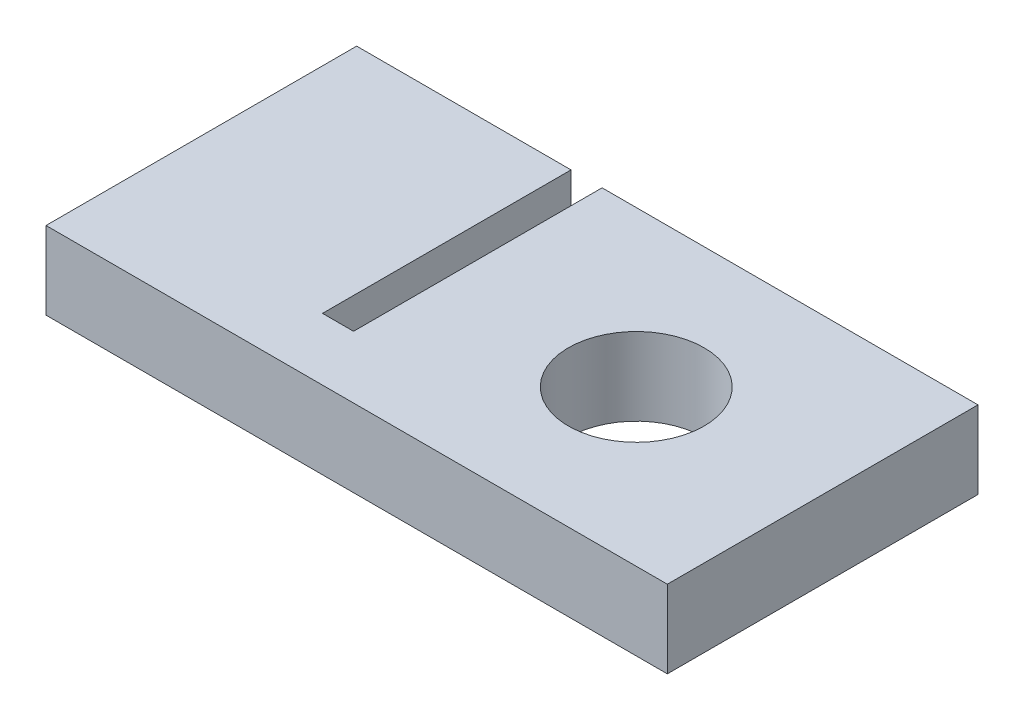
ISO-10303-21;
HEADER;
FILE_DESCRIPTION(('STEP AP214'),'2;1');
FILE_NAME('part.step','',(''),(''),'','','');
FILE_SCHEMA(('AUTOMOTIVE_DESIGN { 1 0 10303 214 1 1 1 1 }'));
ENDSEC;
DATA;
#1=APPLICATION_CONTEXT('core data for automotive mechanical design processes');
#2=APPLICATION_PROTOCOL_DEFINITION('international standard','automotive_design',2000,#1);
#3=PRODUCT_CONTEXT('',#1,'mechanical');
#4=PRODUCT('Part','Part','',(#3));
#5=PRODUCT_RELATED_PRODUCT_CATEGORY('part','',(#4));
#6=PRODUCT_DEFINITION_FORMATION('','',#4);
#7=PRODUCT_DEFINITION_CONTEXT('part definition',#1,'design');
#8=PRODUCT_DEFINITION('design','',#6,#7);
#9=PRODUCT_DEFINITION_SHAPE('','',#8);
#10=(LENGTH_UNIT() NAMED_UNIT(*) SI_UNIT(.MILLI.,.METRE.));
#11=(NAMED_UNIT(*) PLANE_ANGLE_UNIT() SI_UNIT($,.RADIAN.));
#12=(NAMED_UNIT(*) SI_UNIT($,.STERADIAN.) SOLID_ANGLE_UNIT());
#13=UNCERTAINTY_MEASURE_WITH_UNIT(LENGTH_MEASURE(1.E-05),#10,'distance_accuracy_value','');
#14=(GEOMETRIC_REPRESENTATION_CONTEXT(3) GLOBAL_UNCERTAINTY_ASSIGNED_CONTEXT((#13)) GLOBAL_UNIT_ASSIGNED_CONTEXT((#10,
#11,#12)) REPRESENTATION_CONTEXT('',''));
#15=CARTESIAN_POINT('',(0.,0.,0.));
#16=DIRECTION('',(0.,0.,1.));
#17=DIRECTION('',(1.,0.,0.));
#18=AXIS2_PLACEMENT_3D('',#15,#16,#17);
#19=CARTESIAN_POINT('',(5.,1.25,-2.5));
#20=DIRECTION('',(-1.,0.,0.));
#21=DIRECTION('',(0.,0.,-1.));
#22=AXIS2_PLACEMENT_3D('',#19,#20,#21);
#23=PLANE('',#22);
#24=DIRECTION('',(0.,0.,1.));
#25=VECTOR('',#24,1.);
#26=CARTESIAN_POINT('',(5.,0.,-2.5));
#27=LINE('',#26,#25);
#28=CARTESIAN_POINT('',(5.,0.,-2.5));
#29=VERTEX_POINT('',#28);
#30=CARTESIAN_POINT('',(5.,0.,2.5));
#31=VERTEX_POINT('',#30);
#32=EDGE_CURVE('E133',#29,#31,#27,.T.);
#33=ORIENTED_EDGE('',*,*,#32,.F.);
#34=DIRECTION('',(0.,-1.,0.));
#35=VECTOR('',#34,1.);
#36=CARTESIAN_POINT('',(5.,1.25,-2.5));
#37=LINE('',#36,#35);
#38=CARTESIAN_POINT('',(5.,1.25,-2.5));
#39=VERTEX_POINT('',#38);
#40=EDGE_CURVE('E132',#39,#29,#37,.T.);
#41=ORIENTED_EDGE('',*,*,#40,.F.);
#42=DIRECTION('',(0.,0.,1.));
#43=VECTOR('',#42,1.);
#44=CARTESIAN_POINT('',(5.,1.25,-2.5));
#45=LINE('',#44,#43);
#46=CARTESIAN_POINT('',(5.,1.25,2.5));
#47=VERTEX_POINT('',#46);
#48=EDGE_CURVE('E152',#39,#47,#45,.T.);
#49=ORIENTED_EDGE('',*,*,#48,.T.);
#50=DIRECTION('',(0.,-1.,0.));
#51=VECTOR('',#50,1.);
#52=CARTESIAN_POINT('',(5.,1.25,2.5));
#53=LINE('',#52,#51);
#54=EDGE_CURVE('E11',#47,#31,#53,.T.);
#55=ORIENTED_EDGE('',*,*,#54,.T.);
#56=EDGE_LOOP('',(#33,#41,#49,#55));
#57=FACE_BOUND('',#56,.T.);
#58=ADVANCED_FACE('F37',(#57),#23,.F.);
#59=CARTESIAN_POINT('',(-5.,1.25,2.5));
#60=DIRECTION('',(0.,0.,-1.));
#61=DIRECTION('',(1.,0.,0.));
#62=AXIS2_PLACEMENT_3D('',#59,#60,#61);
#63=PLANE('',#62);
#64=DIRECTION('',(-1.,0.,0.));
#65=VECTOR('',#64,1.);
#66=CARTESIAN_POINT('',(-5.,0.,2.5));
#67=LINE('',#66,#65);
#68=CARTESIAN_POINT('',(-5.,0.,2.5));
#69=VERTEX_POINT('',#68);
#70=EDGE_CURVE('E135',#31,#69,#67,.T.);
#71=ORIENTED_EDGE('',*,*,#70,.F.);
#72=ORIENTED_EDGE('',*,*,#54,.F.);
#73=DIRECTION('',(-1.,0.,0.));
#74=VECTOR('',#73,1.);
#75=CARTESIAN_POINT('',(-5.,1.25,2.5));
#76=LINE('',#75,#74);
#77=CARTESIAN_POINT('',(-5.,1.25,2.5));
#78=VERTEX_POINT('',#77);
#79=EDGE_CURVE('E91',#47,#78,#76,.T.);
#80=ORIENTED_EDGE('',*,*,#79,.T.);
#81=DIRECTION('',(0.,-1.,0.));
#82=VECTOR('',#81,1.);
#83=CARTESIAN_POINT('',(-5.,1.25,2.5));
#84=LINE('',#83,#82);
#85=EDGE_CURVE('E45',#78,#69,#84,.T.);
#86=ORIENTED_EDGE('',*,*,#85,.T.);
#87=EDGE_LOOP('',(#71,#72,#80,#86));
#88=FACE_BOUND('',#87,.T.);
#89=ADVANCED_FACE('F164',(#88),#63,.F.);
#90=CARTESIAN_POINT('',(-5.,1.25,-2.5));
#91=DIRECTION('',(1.,0.,0.));
#92=DIRECTION('',(0.,0.,1.));
#93=AXIS2_PLACEMENT_3D('',#90,#91,#92);
#94=PLANE('',#93);
#95=DIRECTION('',(0.,0.,-1.));
#96=VECTOR('',#95,1.);
#97=CARTESIAN_POINT('',(-5.,0.,-2.5));
#98=LINE('',#97,#96);
#99=CARTESIAN_POINT('',(-5.,0.,-2.5));
#100=VERTEX_POINT('',#99);
#101=EDGE_CURVE('E139',#69,#100,#98,.T.);
#102=ORIENTED_EDGE('',*,*,#101,.F.);
#103=ORIENTED_EDGE('',*,*,#85,.F.);
#104=DIRECTION('',(0.,0.,-1.));
#105=VECTOR('',#104,1.);
#106=CARTESIAN_POINT('',(-5.,1.25,-2.5));
#107=LINE('',#106,#105);
#108=CARTESIAN_POINT('',(-5.,1.25,-2.5));
#109=VERTEX_POINT('',#108);
#110=EDGE_CURVE('E173',#78,#109,#107,.T.);
#111=ORIENTED_EDGE('',*,*,#110,.T.);
#112=DIRECTION('',(0.,-1.,0.));
#113=VECTOR('',#112,1.);
#114=CARTESIAN_POINT('',(-5.,1.25,-2.5));
#115=LINE('',#114,#113);
#116=EDGE_CURVE('E159',#109,#100,#115,.T.);
#117=ORIENTED_EDGE('',*,*,#116,.T.);
#118=EDGE_LOOP('',(#102,#103,#111,#117));
#119=FACE_BOUND('',#118,.T.);
#120=ADVANCED_FACE('F186',(#119),#94,.F.);
#121=CARTESIAN_POINT('',(-5.,1.25,-2.5));
#122=DIRECTION('',(0.,0.,1.));
#123=DIRECTION('',(-1.,0.,0.));
#124=AXIS2_PLACEMENT_3D('',#121,#122,#123);
#125=PLANE('',#124);
#126=DIRECTION('',(1.,0.,0.));
#127=VECTOR('',#126,1.);
#128=CARTESIAN_POINT('',(-5.,0.,-2.5));
#129=LINE('',#128,#127);
#130=CARTESIAN_POINT('',(-1.55,0.,-2.5));
#131=VERTEX_POINT('',#130);
#132=EDGE_CURVE('E142',#100,#131,#129,.T.);
#133=ORIENTED_EDGE('',*,*,#132,.F.);
#134=ORIENTED_EDGE('',*,*,#116,.F.);
#135=DIRECTION('',(1.,0.,0.));
#136=VECTOR('',#135,1.);
#137=CARTESIAN_POINT('',(-5.,1.25,-2.5));
#138=LINE('',#137,#136);
#139=CARTESIAN_POINT('',(-1.55,1.25,-2.5));
#140=VERTEX_POINT('',#139);
#141=EDGE_CURVE('E127',#109,#140,#138,.T.);
#142=ORIENTED_EDGE('',*,*,#141,.T.);
#143=DIRECTION('',(0.,-1.,0.));
#144=VECTOR('',#143,1.);
#145=CARTESIAN_POINT('',(-1.55,1.25,-2.5));
#146=LINE('',#145,#144);
#147=EDGE_CURVE('E156',#140,#131,#146,.T.);
#148=ORIENTED_EDGE('',*,*,#147,.T.);
#149=EDGE_LOOP('',(#133,#134,#142,#148));
#150=FACE_BOUND('',#149,.T.);
#151=ADVANCED_FACE('F182',(#150),#125,.F.);
#152=CARTESIAN_POINT('',(-1.55,1.25,-2.5));
#153=DIRECTION('',(-1.,0.,0.));
#154=DIRECTION('',(0.,0.,-1.));
#155=AXIS2_PLACEMENT_3D('',#152,#153,#154);
#156=PLANE('',#155);
#157=DIRECTION('',(0.,0.,1.));
#158=VECTOR('',#157,1.);
#159=CARTESIAN_POINT('',(-1.55,0.,-2.5));
#160=LINE('',#159,#158);
#161=CARTESIAN_POINT('',(-1.55,0.,1.5));
#162=VERTEX_POINT('',#161);
#163=EDGE_CURVE('E145',#131,#162,#160,.T.);
#164=ORIENTED_EDGE('',*,*,#163,.F.);
#165=ORIENTED_EDGE('',*,*,#147,.F.);
#166=DIRECTION('',(0.,0.,1.));
#167=VECTOR('',#166,1.);
#168=CARTESIAN_POINT('',(-1.55,1.25,-2.5));
#169=LINE('',#168,#167);
#170=CARTESIAN_POINT('',(-1.55,1.25,1.5));
#171=VERTEX_POINT('',#170);
#172=EDGE_CURVE('E125',#140,#171,#169,.T.);
#173=ORIENTED_EDGE('',*,*,#172,.T.);
#174=DIRECTION('',(0.,-1.,0.));
#175=VECTOR('',#174,1.);
#176=CARTESIAN_POINT('',(-1.55,1.25,1.5));
#177=LINE('',#176,#175);
#178=EDGE_CURVE('E119',#171,#162,#177,.T.);
#179=ORIENTED_EDGE('',*,*,#178,.T.);
#180=EDGE_LOOP('',(#164,#165,#173,#179));
#181=FACE_BOUND('',#180,.T.);
#182=ADVANCED_FACE('F185',(#181),#156,.F.);
#183=CARTESIAN_POINT('',(-1.55,1.25,1.5));
#184=DIRECTION('',(0.,0.,1.));
#185=DIRECTION('',(-1.,0.,0.));
#186=AXIS2_PLACEMENT_3D('',#183,#184,#185);
#187=PLANE('',#186);
#188=DIRECTION('',(1.,0.,0.));
#189=VECTOR('',#188,1.);
#190=CARTESIAN_POINT('',(-1.55,0.,1.5));
#191=LINE('',#190,#189);
#192=CARTESIAN_POINT('',(-1.05,0.,1.5));
#193=VERTEX_POINT('',#192);
#194=EDGE_CURVE('E148',#162,#193,#191,.T.);
#195=ORIENTED_EDGE('',*,*,#194,.F.);
#196=ORIENTED_EDGE('',*,*,#178,.F.);
#197=DIRECTION('',(1.,0.,0.));
#198=VECTOR('',#197,1.);
#199=CARTESIAN_POINT('',(-1.55,1.25,1.5));
#200=LINE('',#199,#198);
#201=CARTESIAN_POINT('',(-1.05,1.25,1.5));
#202=VERTEX_POINT('',#201);
#203=EDGE_CURVE('E109',#171,#202,#200,.T.);
#204=ORIENTED_EDGE('',*,*,#203,.T.);
#205=DIRECTION('',(0.,-1.,0.));
#206=VECTOR('',#205,1.);
#207=CARTESIAN_POINT('',(-1.05,1.25,1.5));
#208=LINE('',#207,#206);
#209=EDGE_CURVE('E114',#202,#193,#208,.T.);
#210=ORIENTED_EDGE('',*,*,#209,.T.);
#211=EDGE_LOOP('',(#195,#196,#204,#210));
#212=FACE_BOUND('',#211,.T.);
#213=ADVANCED_FACE('F122',(#212),#187,.F.);
#214=CARTESIAN_POINT('',(-1.05,1.25,-2.5));
#215=DIRECTION('',(1.,0.,0.));
#216=DIRECTION('',(0.,0.,1.));
#217=AXIS2_PLACEMENT_3D('',#214,#215,#216);
#218=PLANE('',#217);
#219=DIRECTION('',(0.,0.,-1.));
#220=VECTOR('',#219,1.);
#221=CARTESIAN_POINT('',(-1.05,0.,-2.5));
#222=LINE('',#221,#220);
#223=CARTESIAN_POINT('',(-1.05,0.,-2.5));
#224=VERTEX_POINT('',#223);
#225=EDGE_CURVE('E116',#193,#224,#222,.T.);
#226=ORIENTED_EDGE('',*,*,#225,.F.);
#227=ORIENTED_EDGE('',*,*,#209,.F.);
#228=DIRECTION('',(0.,0.,-1.));
#229=VECTOR('',#228,1.);
#230=CARTESIAN_POINT('',(-1.05,1.25,-2.5));
#231=LINE('',#230,#229);
#232=CARTESIAN_POINT('',(-1.05,1.25,-2.5));
#233=VERTEX_POINT('',#232);
#234=EDGE_CURVE('E105',#202,#233,#231,.T.);
#235=ORIENTED_EDGE('',*,*,#234,.T.);
#236=DIRECTION('',(0.,-1.,0.));
#237=VECTOR('',#236,1.);
#238=CARTESIAN_POINT('',(-1.05,1.25,-2.5));
#239=LINE('',#238,#237);
#240=EDGE_CURVE('E120',#233,#224,#239,.T.);
#241=ORIENTED_EDGE('',*,*,#240,.T.);
#242=EDGE_LOOP('',(#226,#227,#235,#241));
#243=FACE_BOUND('',#242,.T.);
#244=ADVANCED_FACE('F115',(#243),#218,.F.);
#245=CARTESIAN_POINT('',(-1.05,1.25,-2.5));
#246=DIRECTION('',(0.,0.,1.));
#247=DIRECTION('',(-1.,0.,0.));
#248=AXIS2_PLACEMENT_3D('',#245,#246,#247);
#249=PLANE('',#248);
#250=DIRECTION('',(1.,0.,0.));
#251=VECTOR('',#250,1.);
#252=CARTESIAN_POINT('',(-1.05,0.,-2.5));
#253=LINE('',#252,#251);
#254=EDGE_CURVE('E79',#224,#29,#253,.T.);
#255=ORIENTED_EDGE('',*,*,#254,.F.);
#256=ORIENTED_EDGE('',*,*,#240,.F.);
#257=DIRECTION('',(1.,0.,0.));
#258=VECTOR('',#257,1.);
#259=CARTESIAN_POINT('',(-1.05,1.25,-2.5));
#260=LINE('',#259,#258);
#261=EDGE_CURVE('E53',#233,#39,#260,.T.);
#262=ORIENTED_EDGE('',*,*,#261,.T.);
#263=ORIENTED_EDGE('',*,*,#40,.T.);
#264=EDGE_LOOP('',(#255,#256,#262,#263));
#265=FACE_BOUND('',#264,.T.);
#266=ADVANCED_FACE('F236',(#265),#249,.F.);
#267=CARTESIAN_POINT('',(0.,1.25,0.));
#268=DIRECTION('',(0.,-1.,0.));
#269=DIRECTION('',(0.,0.,1.));
#270=AXIS2_PLACEMENT_3D('',#267,#268,#269);
#271=PLANE('',#270);
#272=CARTESIAN_POINT('',(2.,1.25,0.));
#273=DIRECTION('',(0.,-1.,0.));
#274=DIRECTION('',(0.,0.,-1.));
#275=AXIS2_PLACEMENT_3D('',#272,#273,#274);
#276=CIRCLE('',#275,1.0922);
#277=CARTESIAN_POINT('',(2.,1.25,-1.0922));
#278=VERTEX_POINT('',#277);
#279=EDGE_CURVE('E176',#278,#278,#276,.T.);
#280=ORIENTED_EDGE('',*,*,#279,.T.);
#281=EDGE_LOOP('',(#280));
#282=FACE_BOUND('',#281,.T.);
#283=ORIENTED_EDGE('',*,*,#48,.F.);
#284=ORIENTED_EDGE('',*,*,#261,.F.);
#285=ORIENTED_EDGE('',*,*,#234,.F.);
#286=ORIENTED_EDGE('',*,*,#203,.F.);
#287=ORIENTED_EDGE('',*,*,#172,.F.);
#288=ORIENTED_EDGE('',*,*,#141,.F.);
#289=ORIENTED_EDGE('',*,*,#110,.F.);
#290=ORIENTED_EDGE('',*,*,#79,.F.);
#291=EDGE_LOOP('',(#283,#284,#285,#286,#287,#288,#289,#290));
#292=FACE_BOUND('',#291,.T.);
#293=ADVANCED_FACE('F107',(#282,#292),#271,.F.);
#294=CARTESIAN_POINT('',(0.,0.,0.));
#295=DIRECTION('',(0.,-1.,0.));
#296=DIRECTION('',(0.,0.,1.));
#297=AXIS2_PLACEMENT_3D('',#294,#295,#296);
#298=PLANE('',#297);
#299=CARTESIAN_POINT('',(2.,0.,0.));
#300=DIRECTION('',(0.,-1.,0.));
#301=DIRECTION('',(0.,0.,-1.));
#302=AXIS2_PLACEMENT_3D('',#299,#300,#301);
#303=CIRCLE('',#302,1.0922);
#304=CARTESIAN_POINT('',(2.,0.,-1.0922));
#305=VERTEX_POINT('',#304);
#306=EDGE_CURVE('E136',#305,#305,#303,.T.);
#307=ORIENTED_EDGE('',*,*,#306,.F.);
#308=EDGE_LOOP('',(#307));
#309=FACE_BOUND('',#308,.T.);
#310=ORIENTED_EDGE('',*,*,#32,.T.);
#311=ORIENTED_EDGE('',*,*,#70,.T.);
#312=ORIENTED_EDGE('',*,*,#101,.T.);
#313=ORIENTED_EDGE('',*,*,#132,.T.);
#314=ORIENTED_EDGE('',*,*,#163,.T.);
#315=ORIENTED_EDGE('',*,*,#194,.T.);
#316=ORIENTED_EDGE('',*,*,#225,.T.);
#317=ORIENTED_EDGE('',*,*,#254,.T.);
#318=EDGE_LOOP('',(#310,#311,#312,#313,#314,#315,#316,#317));
#319=FACE_BOUND('',#318,.T.);
#320=ADVANCED_FACE('F167',(#309,#319),#298,.T.);
#321=CARTESIAN_POINT('',(2.,0.,0.));
#322=DIRECTION('',(0.,1.,0.));
#323=DIRECTION('',(0.,0.,-1.));
#324=AXIS2_PLACEMENT_3D('',#321,#322,#323);
#325=CYLINDRICAL_SURFACE('',#324,1.0922);
#326=ORIENTED_EDGE('',*,*,#306,.T.);
#327=EDGE_LOOP('',(#326));
#328=FACE_BOUND('',#327,.T.);
#329=ORIENTED_EDGE('',*,*,#279,.F.);
#330=EDGE_LOOP('',(#329));
#331=FACE_BOUND('',#330,.T.);
#332=ADVANCED_FACE('F262',(#328,#331),#325,.F.);
#333=CLOSED_SHELL('',(#58,#89,#120,#151,#182,#213,#244,#266,#293,#320,#332));
#334=MANIFOLD_SOLID_BREP('B2',#333);
#335=ADVANCED_BREP_SHAPE_REPRESENTATION('',(#18,#334),#14);
#336=SHAPE_DEFINITION_REPRESENTATION(#9,#335);
ENDSEC;
END-ISO-10303-21;
